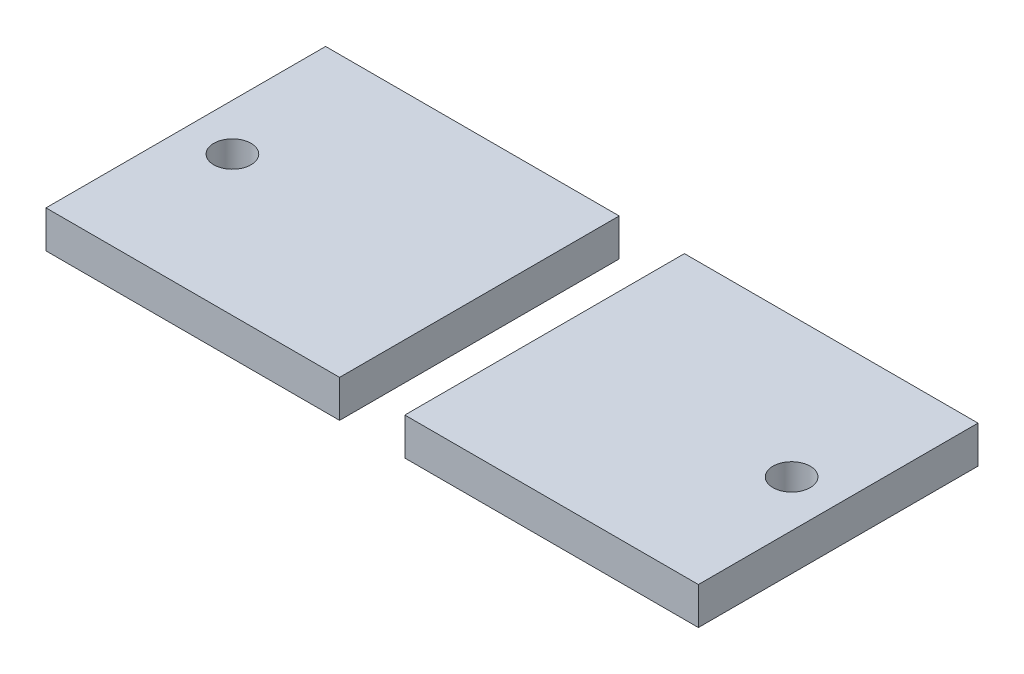
ISO-10303-21;
HEADER;
FILE_DESCRIPTION(('STEP AP214'),'2;1');
FILE_NAME('part.step','',(''),(''),'','','');
FILE_SCHEMA(('AUTOMOTIVE_DESIGN { 1 0 10303 214 1 1 1 1 }'));
ENDSEC;
DATA;
#1=APPLICATION_CONTEXT('core data for automotive mechanical design processes');
#2=APPLICATION_PROTOCOL_DEFINITION('international standard','automotive_design',2000,#1);
#3=PRODUCT_CONTEXT('',#1,'mechanical');
#4=PRODUCT('Part','Part','',(#3));
#5=PRODUCT_RELATED_PRODUCT_CATEGORY('part','',(#4));
#6=PRODUCT_DEFINITION_FORMATION('','',#4);
#7=PRODUCT_DEFINITION_CONTEXT('part definition',#1,'design');
#8=PRODUCT_DEFINITION('design','',#6,#7);
#9=PRODUCT_DEFINITION_SHAPE('','',#8);
#10=(LENGTH_UNIT() NAMED_UNIT(*) SI_UNIT(.MILLI.,.METRE.));
#11=(NAMED_UNIT(*) PLANE_ANGLE_UNIT() SI_UNIT($,.RADIAN.));
#12=(NAMED_UNIT(*) SI_UNIT($,.STERADIAN.) SOLID_ANGLE_UNIT());
#13=UNCERTAINTY_MEASURE_WITH_UNIT(LENGTH_MEASURE(1.E-05),#10,'distance_accuracy_value','');
#14=(GEOMETRIC_REPRESENTATION_CONTEXT(3) GLOBAL_UNCERTAINTY_ASSIGNED_CONTEXT((#13)) GLOBAL_UNIT_ASSIGNED_CONTEXT((#10,
#11,#12)) REPRESENTATION_CONTEXT('',''));
#15=CARTESIAN_POINT('',(0.,0.,0.));
#16=DIRECTION('',(0.,0.,1.));
#17=DIRECTION('',(1.,0.,0.));
#18=AXIS2_PLACEMENT_3D('',#15,#16,#17);
#19=CARTESIAN_POINT('',(3.49999999999999,4.,0.));
#20=DIRECTION('',(-1.,0.,0.));
#21=DIRECTION('',(0.,0.,1.));
#22=AXIS2_PLACEMENT_3D('',#19,#20,#21);
#23=PLANE('',#22);
#24=DIRECTION('',(0.,0.,-1.));
#25=VECTOR('',#24,1.);
#26=CARTESIAN_POINT('',(3.49999999999999,0.,0.));
#27=LINE('',#26,#25);
#28=CARTESIAN_POINT('',(3.49999999999999,0.,15.));
#29=VERTEX_POINT('',#28);
#30=CARTESIAN_POINT('',(3.49999999999999,0.,-15.));
#31=VERTEX_POINT('',#30);
#32=EDGE_CURVE('E112',#29,#31,#27,.T.);
#33=ORIENTED_EDGE('',*,*,#32,.F.);
#34=DIRECTION('',(0.,-1.,0.));
#35=VECTOR('',#34,1.);
#36=CARTESIAN_POINT('',(3.49999999999999,4.,15.));
#37=LINE('',#36,#35);
#38=CARTESIAN_POINT('',(3.49999999999999,4.,15.));
#39=VERTEX_POINT('',#38);
#40=EDGE_CURVE('E12',#39,#29,#37,.T.);
#41=ORIENTED_EDGE('',*,*,#40,.F.);
#42=DIRECTION('',(0.,0.,-1.));
#43=VECTOR('',#42,1.);
#44=CARTESIAN_POINT('',(3.49999999999999,4.,0.));
#45=LINE('',#44,#43);
#46=CARTESIAN_POINT('',(3.49999999999999,4.,-15.));
#47=VERTEX_POINT('',#46);
#48=EDGE_CURVE('E97',#39,#47,#45,.T.);
#49=ORIENTED_EDGE('',*,*,#48,.T.);
#50=DIRECTION('',(0.,-1.,0.));
#51=VECTOR('',#50,1.);
#52=CARTESIAN_POINT('',(3.49999999999999,4.,-15.));
#53=LINE('',#52,#51);
#54=EDGE_CURVE('E65',#47,#31,#53,.T.);
#55=ORIENTED_EDGE('',*,*,#54,.T.);
#56=EDGE_LOOP('',(#33,#41,#49,#55));
#57=FACE_BOUND('',#56,.T.);
#58=ADVANCED_FACE('F49',(#57),#23,.T.);
#59=CARTESIAN_POINT('',(0.,4.,15.));
#60=DIRECTION('',(0.,0.,-1.));
#61=DIRECTION('',(-1.,0.,0.));
#62=AXIS2_PLACEMENT_3D('',#59,#60,#61);
#63=PLANE('',#62);
#64=DIRECTION('',(1.,0.,0.));
#65=VECTOR('',#64,1.);
#66=CARTESIAN_POINT('',(0.,0.,15.));
#67=LINE('',#66,#65);
#68=CARTESIAN_POINT('',(35.,0.,15.));
#69=VERTEX_POINT('',#68);
#70=EDGE_CURVE('E103',#29,#69,#67,.T.);
#71=ORIENTED_EDGE('',*,*,#70,.T.);
#72=DIRECTION('',(0.,-1.,0.));
#73=VECTOR('',#72,1.);
#74=CARTESIAN_POINT('',(35.,4.,15.));
#75=LINE('',#74,#73);
#76=CARTESIAN_POINT('',(35.,4.,15.));
#77=VERTEX_POINT('',#76);
#78=EDGE_CURVE('E57',#77,#69,#75,.T.);
#79=ORIENTED_EDGE('',*,*,#78,.F.);
#80=DIRECTION('',(1.,0.,0.));
#81=VECTOR('',#80,1.);
#82=CARTESIAN_POINT('',(0.,4.,15.));
#83=LINE('',#82,#81);
#84=EDGE_CURVE('E91',#39,#77,#83,.T.);
#85=ORIENTED_EDGE('',*,*,#84,.F.);
#86=ORIENTED_EDGE('',*,*,#40,.T.);
#87=EDGE_LOOP('',(#71,#79,#85,#86));
#88=FACE_BOUND('',#87,.T.);
#89=ADVANCED_FACE('F101',(#88),#63,.F.);
#90=CARTESIAN_POINT('',(35.,4.,0.));
#91=DIRECTION('',(1.,0.,0.));
#92=DIRECTION('',(0.,0.,-1.));
#93=AXIS2_PLACEMENT_3D('',#90,#91,#92);
#94=PLANE('',#93);
#95=DIRECTION('',(0.,0.,1.));
#96=VECTOR('',#95,1.);
#97=CARTESIAN_POINT('',(35.,0.,0.));
#98=LINE('',#97,#96);
#99=CARTESIAN_POINT('',(35.,0.,-15.));
#100=VERTEX_POINT('',#99);
#101=EDGE_CURVE('E116',#100,#69,#98,.T.);
#102=ORIENTED_EDGE('',*,*,#101,.F.);
#103=DIRECTION('',(0.,-1.,0.));
#104=VECTOR('',#103,1.);
#105=CARTESIAN_POINT('',(35.,4.,-15.));
#106=LINE('',#105,#104);
#107=CARTESIAN_POINT('',(35.,4.,-15.));
#108=VERTEX_POINT('',#107);
#109=EDGE_CURVE('E78',#108,#100,#106,.T.);
#110=ORIENTED_EDGE('',*,*,#109,.F.);
#111=DIRECTION('',(0.,0.,1.));
#112=VECTOR('',#111,1.);
#113=CARTESIAN_POINT('',(35.,4.,0.));
#114=LINE('',#113,#112);
#115=EDGE_CURVE('E96',#108,#77,#114,.T.);
#116=ORIENTED_EDGE('',*,*,#115,.T.);
#117=ORIENTED_EDGE('',*,*,#78,.T.);
#118=EDGE_LOOP('',(#102,#110,#116,#117));
#119=FACE_BOUND('',#118,.T.);
#120=ADVANCED_FACE('F106',(#119),#94,.T.);
#121=CARTESIAN_POINT('',(0.,4.,-15.));
#122=DIRECTION('',(0.,0.,-1.));
#123=DIRECTION('',(-1.,0.,0.));
#124=AXIS2_PLACEMENT_3D('',#121,#122,#123);
#125=PLANE('',#124);
#126=DIRECTION('',(1.,0.,0.));
#127=VECTOR('',#126,1.);
#128=CARTESIAN_POINT('',(0.,0.,-15.));
#129=LINE('',#128,#127);
#130=EDGE_CURVE('E118',#31,#100,#129,.T.);
#131=ORIENTED_EDGE('',*,*,#130,.F.);
#132=ORIENTED_EDGE('',*,*,#54,.F.);
#133=DIRECTION('',(1.,0.,0.));
#134=VECTOR('',#133,1.);
#135=CARTESIAN_POINT('',(0.,4.,-15.));
#136=LINE('',#135,#134);
#137=EDGE_CURVE('E107',#47,#108,#136,.T.);
#138=ORIENTED_EDGE('',*,*,#137,.T.);
#139=ORIENTED_EDGE('',*,*,#109,.T.);
#140=EDGE_LOOP('',(#131,#132,#138,#139));
#141=FACE_BOUND('',#140,.T.);
#142=ADVANCED_FACE('F134',(#141),#125,.T.);
#143=CARTESIAN_POINT('',(0.,4.,0.));
#144=DIRECTION('',(0.,1.,0.));
#145=DIRECTION('',(0.,0.,1.));
#146=AXIS2_PLACEMENT_3D('',#143,#144,#145);
#147=PLANE('',#146);
#148=CARTESIAN_POINT('',(30.,4.,0.));
#149=DIRECTION('',(0.,1.,0.));
#150=DIRECTION('',(0.,0.,1.));
#151=AXIS2_PLACEMENT_3D('',#148,#149,#150);
#152=CIRCLE('',#151,2.);
#153=CARTESIAN_POINT('',(30.,4.,1.99999999999999));
#154=VERTEX_POINT('',#153);
#155=EDGE_CURVE('E114',#154,#154,#152,.T.);
#156=ORIENTED_EDGE('',*,*,#155,.F.);
#157=EDGE_LOOP('',(#156));
#158=FACE_BOUND('',#157,.T.);
#159=ORIENTED_EDGE('',*,*,#48,.F.);
#160=ORIENTED_EDGE('',*,*,#84,.T.);
#161=ORIENTED_EDGE('',*,*,#115,.F.);
#162=ORIENTED_EDGE('',*,*,#137,.F.);
#163=EDGE_LOOP('',(#159,#160,#161,#162));
#164=FACE_BOUND('',#163,.T.);
#165=ADVANCED_FACE('F93',(#158,#164),#147,.T.);
#166=CARTESIAN_POINT('',(0.,0.,0.));
#167=DIRECTION('',(0.,1.,0.));
#168=DIRECTION('',(0.,0.,1.));
#169=AXIS2_PLACEMENT_3D('',#166,#167,#168);
#170=PLANE('',#169);
#171=CARTESIAN_POINT('',(30.,0.,0.));
#172=DIRECTION('',(0.,1.,0.));
#173=DIRECTION('',(0.,0.,1.));
#174=AXIS2_PLACEMENT_3D('',#171,#172,#173);
#175=CIRCLE('',#174,2.);
#176=CARTESIAN_POINT('',(30.,0.,1.99999999999999));
#177=VERTEX_POINT('',#176);
#178=EDGE_CURVE('E124',#177,#177,#175,.T.);
#179=ORIENTED_EDGE('',*,*,#178,.T.);
#180=EDGE_LOOP('',(#179));
#181=FACE_BOUND('',#180,.T.);
#182=ORIENTED_EDGE('',*,*,#32,.T.);
#183=ORIENTED_EDGE('',*,*,#130,.T.);
#184=ORIENTED_EDGE('',*,*,#101,.T.);
#185=ORIENTED_EDGE('',*,*,#70,.F.);
#186=EDGE_LOOP('',(#182,#183,#184,#185));
#187=FACE_BOUND('',#186,.T.);
#188=ADVANCED_FACE('F133',(#181,#187),#170,.F.);
#189=CARTESIAN_POINT('',(30.,0.,0.));
#190=DIRECTION('',(0.,1.,0.));
#191=DIRECTION('',(0.,0.,1.));
#192=AXIS2_PLACEMENT_3D('',#189,#190,#191);
#193=CYLINDRICAL_SURFACE('',#192,2.);
#194=ORIENTED_EDGE('',*,*,#178,.F.);
#195=EDGE_LOOP('',(#194));
#196=FACE_BOUND('',#195,.T.);
#197=ORIENTED_EDGE('',*,*,#155,.T.);
#198=EDGE_LOOP('',(#197));
#199=FACE_BOUND('',#198,.T.);
#200=ADVANCED_FACE('F130',(#196,#199),#193,.F.);
#201=CLOSED_SHELL('',(#58,#89,#120,#142,#165,#188,#200));
#202=MANIFOLD_SOLID_BREP('B2',#201);
#203=CARTESIAN_POINT('',(0.,4.,15.));
#204=DIRECTION('',(0.,0.,-1.));
#205=DIRECTION('',(-1.,0.,0.));
#206=AXIS2_PLACEMENT_3D('',#203,#204,#205);
#207=PLANE('',#206);
#208=DIRECTION('',(1.,0.,0.));
#209=VECTOR('',#208,1.);
#210=CARTESIAN_POINT('',(0.,0.,15.));
#211=LINE('',#210,#209);
#212=CARTESIAN_POINT('',(-35.,0.,15.));
#213=VERTEX_POINT('',#212);
#214=CARTESIAN_POINT('',(-3.50000000000001,0.,15.));
#215=VERTEX_POINT('',#214);
#216=EDGE_CURVE('E270',#213,#215,#211,.T.);
#217=ORIENTED_EDGE('',*,*,#216,.T.);
#218=DIRECTION('',(0.,-1.,0.));
#219=VECTOR('',#218,1.);
#220=CARTESIAN_POINT('',(-3.50000000000001,4.,15.));
#221=LINE('',#220,#219);
#222=CARTESIAN_POINT('',(-3.50000000000001,4.,15.));
#223=VERTEX_POINT('',#222);
#224=EDGE_CURVE('E47',#223,#215,#221,.T.);
#225=ORIENTED_EDGE('',*,*,#224,.F.);
#226=DIRECTION('',(1.,0.,0.));
#227=VECTOR('',#226,1.);
#228=CARTESIAN_POINT('',(0.,4.,15.));
#229=LINE('',#228,#227);
#230=CARTESIAN_POINT('',(-35.,4.,15.));
#231=VERTEX_POINT('',#230);
#232=EDGE_CURVE('E255',#231,#223,#229,.T.);
#233=ORIENTED_EDGE('',*,*,#232,.F.);
#234=DIRECTION('',(0.,-1.,0.));
#235=VECTOR('',#234,1.);
#236=CARTESIAN_POINT('',(-35.,4.,15.));
#237=LINE('',#236,#235);
#238=EDGE_CURVE('E266',#231,#213,#237,.T.);
#239=ORIENTED_EDGE('',*,*,#238,.T.);
#240=EDGE_LOOP('',(#217,#225,#233,#239));
#241=FACE_BOUND('',#240,.T.);
#242=ADVANCED_FACE('F208',(#241),#207,.F.);
#243=CARTESIAN_POINT('',(-3.50000000000001,4.,0.));
#244=DIRECTION('',(-1.,0.,0.));
#245=DIRECTION('',(0.,0.,1.));
#246=AXIS2_PLACEMENT_3D('',#243,#244,#245);
#247=PLANE('',#246);
#248=DIRECTION('',(0.,0.,-1.));
#249=VECTOR('',#248,1.);
#250=CARTESIAN_POINT('',(-3.50000000000001,0.,0.));
#251=LINE('',#250,#249);
#252=CARTESIAN_POINT('',(-3.50000000000001,0.,-15.));
#253=VERTEX_POINT('',#252);
#254=EDGE_CURVE('E260',#215,#253,#251,.T.);
#255=ORIENTED_EDGE('',*,*,#254,.T.);
#256=DIRECTION('',(0.,-1.,0.));
#257=VECTOR('',#256,1.);
#258=CARTESIAN_POINT('',(-3.50000000000001,4.,-15.));
#259=LINE('',#258,#257);
#260=CARTESIAN_POINT('',(-3.50000000000001,4.,-15.));
#261=VERTEX_POINT('',#260);
#262=EDGE_CURVE('E216',#261,#253,#259,.T.);
#263=ORIENTED_EDGE('',*,*,#262,.F.);
#264=DIRECTION('',(0.,0.,-1.));
#265=VECTOR('',#264,1.);
#266=CARTESIAN_POINT('',(-3.50000000000001,4.,0.));
#267=LINE('',#266,#265);
#268=EDGE_CURVE('E250',#223,#261,#267,.T.);
#269=ORIENTED_EDGE('',*,*,#268,.F.);
#270=ORIENTED_EDGE('',*,*,#224,.T.);
#271=EDGE_LOOP('',(#255,#263,#269,#270));
#272=FACE_BOUND('',#271,.T.);
#273=ADVANCED_FACE('F259',(#272),#247,.F.);
#274=CARTESIAN_POINT('',(0.,4.,-15.));
#275=DIRECTION('',(0.,0.,-1.));
#276=DIRECTION('',(-1.,0.,0.));
#277=AXIS2_PLACEMENT_3D('',#274,#275,#276);
#278=PLANE('',#277);
#279=DIRECTION('',(1.,0.,0.));
#280=VECTOR('',#279,1.);
#281=CARTESIAN_POINT('',(0.,0.,-15.));
#282=LINE('',#281,#280);
#283=CARTESIAN_POINT('',(-35.,0.,-15.));
#284=VERTEX_POINT('',#283);
#285=EDGE_CURVE('E275',#284,#253,#282,.T.);
#286=ORIENTED_EDGE('',*,*,#285,.F.);
#287=DIRECTION('',(0.,-1.,0.));
#288=VECTOR('',#287,1.);
#289=CARTESIAN_POINT('',(-35.,4.,-15.));
#290=LINE('',#289,#288);
#291=CARTESIAN_POINT('',(-35.,4.,-15.));
#292=VERTEX_POINT('',#291);
#293=EDGE_CURVE('E240',#292,#284,#290,.T.);
#294=ORIENTED_EDGE('',*,*,#293,.F.);
#295=DIRECTION('',(1.,0.,0.));
#296=VECTOR('',#295,1.);
#297=CARTESIAN_POINT('',(0.,4.,-15.));
#298=LINE('',#297,#296);
#299=EDGE_CURVE('E253',#292,#261,#298,.T.);
#300=ORIENTED_EDGE('',*,*,#299,.T.);
#301=ORIENTED_EDGE('',*,*,#262,.T.);
#302=EDGE_LOOP('',(#286,#294,#300,#301));
#303=FACE_BOUND('',#302,.T.);
#304=ADVANCED_FACE('F264',(#303),#278,.T.);
#305=CARTESIAN_POINT('',(-35.,4.,0.));
#306=DIRECTION('',(1.,0.,0.));
#307=DIRECTION('',(0.,0.,-1.));
#308=AXIS2_PLACEMENT_3D('',#305,#306,#307);
#309=PLANE('',#308);
#310=DIRECTION('',(0.,0.,1.));
#311=VECTOR('',#310,1.);
#312=CARTESIAN_POINT('',(-35.,0.,0.));
#313=LINE('',#312,#311);
#314=EDGE_CURVE('E243',#284,#213,#313,.T.);
#315=ORIENTED_EDGE('',*,*,#314,.T.);
#316=ORIENTED_EDGE('',*,*,#238,.F.);
#317=DIRECTION('',(0.,0.,1.));
#318=VECTOR('',#317,1.);
#319=CARTESIAN_POINT('',(-35.,4.,0.));
#320=LINE('',#319,#318);
#321=EDGE_CURVE('E224',#292,#231,#320,.T.);
#322=ORIENTED_EDGE('',*,*,#321,.F.);
#323=ORIENTED_EDGE('',*,*,#293,.T.);
#324=EDGE_LOOP('',(#315,#316,#322,#323));
#325=FACE_BOUND('',#324,.T.);
#326=ADVANCED_FACE('F293',(#325),#309,.F.);
#327=CARTESIAN_POINT('',(0.,4.,0.));
#328=DIRECTION('',(0.,1.,0.));
#329=DIRECTION('',(0.,0.,1.));
#330=AXIS2_PLACEMENT_3D('',#327,#328,#329);
#331=PLANE('',#330);
#332=CARTESIAN_POINT('',(-30.,4.,0.));
#333=DIRECTION('',(0.,1.,0.));
#334=DIRECTION('',(0.,0.,1.));
#335=AXIS2_PLACEMENT_3D('',#332,#333,#334);
#336=CIRCLE('',#335,2.);
#337=CARTESIAN_POINT('',(-30.,4.,2.));
#338=VERTEX_POINT('',#337);
#339=EDGE_CURVE('E358',#338,#338,#336,.T.);
#340=ORIENTED_EDGE('',*,*,#339,.F.);
#341=EDGE_LOOP('',(#340));
#342=FACE_BOUND('',#341,.T.);
#343=ORIENTED_EDGE('',*,*,#232,.T.);
#344=ORIENTED_EDGE('',*,*,#268,.T.);
#345=ORIENTED_EDGE('',*,*,#299,.F.);
#346=ORIENTED_EDGE('',*,*,#321,.T.);
#347=EDGE_LOOP('',(#343,#344,#345,#346));
#348=FACE_BOUND('',#347,.T.);
#349=ADVANCED_FACE('F251',(#342,#348),#331,.T.);
#350=CARTESIAN_POINT('',(0.,0.,0.));
#351=DIRECTION('',(0.,1.,0.));
#352=DIRECTION('',(0.,0.,1.));
#353=AXIS2_PLACEMENT_3D('',#350,#351,#352);
#354=PLANE('',#353);
#355=CARTESIAN_POINT('',(-30.,0.,0.));
#356=DIRECTION('',(0.,1.,0.));
#357=DIRECTION('',(0.,0.,1.));
#358=AXIS2_PLACEMENT_3D('',#355,#356,#357);
#359=CIRCLE('',#358,2.);
#360=CARTESIAN_POINT('',(-30.,0.,2.));
#361=VERTEX_POINT('',#360);
#362=EDGE_CURVE('E273',#361,#361,#359,.T.);
#363=ORIENTED_EDGE('',*,*,#362,.T.);
#364=EDGE_LOOP('',(#363));
#365=FACE_BOUND('',#364,.T.);
#366=ORIENTED_EDGE('',*,*,#216,.F.);
#367=ORIENTED_EDGE('',*,*,#314,.F.);
#368=ORIENTED_EDGE('',*,*,#285,.T.);
#369=ORIENTED_EDGE('',*,*,#254,.F.);
#370=EDGE_LOOP('',(#366,#367,#368,#369));
#371=FACE_BOUND('',#370,.T.);
#372=ADVANCED_FACE('F282',(#365,#371),#354,.F.);
#373=CARTESIAN_POINT('',(-30.,0.,0.));
#374=DIRECTION('',(0.,1.,0.));
#375=DIRECTION('',(0.,0.,1.));
#376=AXIS2_PLACEMENT_3D('',#373,#374,#375);
#377=CYLINDRICAL_SURFACE('',#376,2.);
#378=ORIENTED_EDGE('',*,*,#362,.F.);
#379=EDGE_LOOP('',(#378));
#380=FACE_BOUND('',#379,.T.);
#381=ORIENTED_EDGE('',*,*,#339,.T.);
#382=EDGE_LOOP('',(#381));
#383=FACE_BOUND('',#382,.T.);
#384=ADVANCED_FACE('F284',(#380,#383),#377,.F.);
#385=CLOSED_SHELL('',(#242,#273,#304,#326,#349,#372,#384));
#386=MANIFOLD_SOLID_BREP('B6',#385);
#387=ADVANCED_BREP_SHAPE_REPRESENTATION('',(#18,#202,#386),#14);
#388=SHAPE_DEFINITION_REPRESENTATION(#9,#387);
ENDSEC;
END-ISO-10303-21;
